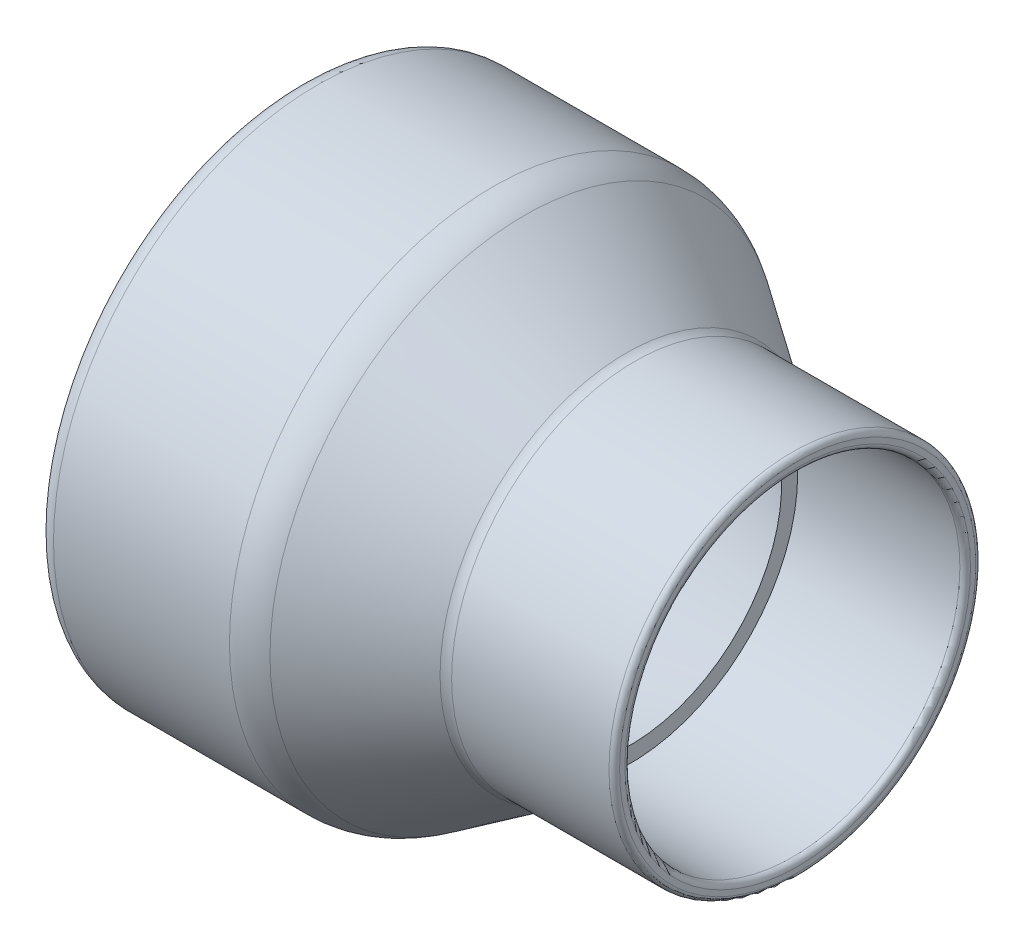
ISO-10303-21;
HEADER;
FILE_DESCRIPTION(('STEP AP214'),'2;1');
FILE_NAME('part.step','',(''),(''),'','','');
FILE_SCHEMA(('AUTOMOTIVE_DESIGN { 1 0 10303 214 1 1 1 1 }'));
ENDSEC;
DATA;
#1=APPLICATION_CONTEXT('core data for automotive mechanical design processes');
#2=APPLICATION_PROTOCOL_DEFINITION('international standard','automotive_design',2000,#1);
#3=PRODUCT_CONTEXT('',#1,'mechanical');
#4=PRODUCT('Part','Part','',(#3));
#5=PRODUCT_RELATED_PRODUCT_CATEGORY('part','',(#4));
#6=PRODUCT_DEFINITION_FORMATION('','',#4);
#7=PRODUCT_DEFINITION_CONTEXT('part definition',#1,'design');
#8=PRODUCT_DEFINITION('design','',#6,#7);
#9=PRODUCT_DEFINITION_SHAPE('','',#8);
#10=(LENGTH_UNIT() NAMED_UNIT(*) SI_UNIT(.MILLI.,.METRE.));
#11=(NAMED_UNIT(*) PLANE_ANGLE_UNIT() SI_UNIT($,.RADIAN.));
#12=(NAMED_UNIT(*) SI_UNIT($,.STERADIAN.) SOLID_ANGLE_UNIT());
#13=UNCERTAINTY_MEASURE_WITH_UNIT(LENGTH_MEASURE(1.E-05),#10,'distance_accuracy_value','');
#14=(GEOMETRIC_REPRESENTATION_CONTEXT(3) GLOBAL_UNCERTAINTY_ASSIGNED_CONTEXT((#13)) GLOBAL_UNIT_ASSIGNED_CONTEXT((#10,
#11,#12)) REPRESENTATION_CONTEXT('',''));
#15=CARTESIAN_POINT('',(0.,0.,0.));
#16=DIRECTION('',(0.,0.,1.));
#17=DIRECTION('',(1.,0.,0.));
#18=AXIS2_PLACEMENT_3D('',#15,#16,#17);
#19=CARTESIAN_POINT('',(9.76,18.1,0.));
#20=DIRECTION('',(-1.,0.,0.));
#21=DIRECTION('',(0.,0.,1.));
#22=AXIS2_PLACEMENT_3D('',#19,#20,#21);
#23=PLANE('',#22);
#24=CARTESIAN_POINT('',(9.76,0.,0.));
#25=DIRECTION('',(-1.,0.,0.));
#26=DIRECTION('',(0.,0.,1.));
#27=AXIS2_PLACEMENT_3D('',#24,#25,#26);
#28=CIRCLE('',#27,20.);
#29=CARTESIAN_POINT('',(9.76,0.,20.));
#30=VERTEX_POINT('',#29);
#31=EDGE_CURVE('E10',#30,#30,#28,.T.);
#32=ORIENTED_EDGE('',*,*,#31,.F.);
#33=EDGE_LOOP('',(#32));
#34=FACE_BOUND('',#33,.T.);
#35=CARTESIAN_POINT('',(9.76,0.,0.));
#36=DIRECTION('',(-1.,0.,0.));
#37=DIRECTION('',(0.,0.,1.));
#38=AXIS2_PLACEMENT_3D('',#35,#36,#37);
#39=CIRCLE('',#38,18.1);
#40=CARTESIAN_POINT('',(9.76,0.,18.1));
#41=VERTEX_POINT('',#40);
#42=EDGE_CURVE('E87',#41,#41,#39,.T.);
#43=ORIENTED_EDGE('',*,*,#42,.T.);
#44=EDGE_LOOP('',(#43));
#45=FACE_BOUND('',#44,.T.);
#46=ADVANCED_FACE('F32',(#34,#45),#23,.F.);
#47=CARTESIAN_POINT('',(-29.76,0.,0.));
#48=DIRECTION('',(-1.,0.,0.));
#49=DIRECTION('',(0.,0.,1.));
#50=AXIS2_PLACEMENT_3D('',#47,#48,#49);
#51=CYLINDRICAL_SURFACE('',#50,20.);
#52=CARTESIAN_POINT('',(29.1266666666667,0.,0.));
#53=DIRECTION('',(-1.,0.,0.));
#54=DIRECTION('',(0.,0.,1.));
#55=AXIS2_PLACEMENT_3D('',#52,#53,#54);
#56=CIRCLE('',#55,20.);
#57=CARTESIAN_POINT('',(29.1266666666667,0.,20.));
#58=VERTEX_POINT('',#57);
#59=EDGE_CURVE('E38',#58,#58,#56,.T.);
#60=ORIENTED_EDGE('',*,*,#59,.F.);
#61=EDGE_LOOP('',(#60));
#62=FACE_BOUND('',#61,.T.);
#63=ORIENTED_EDGE('',*,*,#31,.T.);
#64=EDGE_LOOP('',(#63));
#65=FACE_BOUND('',#64,.T.);
#66=ADVANCED_FACE('F178',(#62,#65),#51,.F.);
#67=CARTESIAN_POINT('',(29.1266666666667,0.,0.));
#68=DIRECTION('',(-1.,0.,0.));
#69=DIRECTION('',(0.,0.,1.));
#70=AXIS2_PLACEMENT_3D('',#67,#68,#69);
#71=TOROIDAL_SURFACE('',#70,20.6333333333333,0.633333333333333);
#72=CARTESIAN_POINT('',(29.76,0.,0.));
#73=DIRECTION('',(-1.,0.,0.));
#74=DIRECTION('',(0.,0.,1.));
#75=AXIS2_PLACEMENT_3D('',#72,#73,#74);
#76=CIRCLE('',#75,20.6333333333333);
#77=CARTESIAN_POINT('',(29.76,0.,20.6333333333333));
#78=VERTEX_POINT('',#77);
#79=EDGE_CURVE('E42',#78,#78,#76,.T.);
#80=ORIENTED_EDGE('',*,*,#79,.F.);
#81=EDGE_LOOP('',(#80));
#82=FACE_BOUND('',#81,.T.);
#83=ORIENTED_EDGE('',*,*,#59,.T.);
#84=EDGE_LOOP('',(#83));
#85=FACE_BOUND('',#84,.T.);
#86=ADVANCED_FACE('F173',(#82,#85),#71,.T.);
#87=CARTESIAN_POINT('',(29.76,20.6333333333333,0.));
#88=DIRECTION('',(-1.,0.,0.));
#89=DIRECTION('',(0.,0.,1.));
#90=AXIS2_PLACEMENT_3D('',#87,#88,#89);
#91=PLANE('',#90);
#92=CARTESIAN_POINT('',(29.76,0.,0.));
#93=DIRECTION('',(-1.,0.,0.));
#94=DIRECTION('',(0.,0.,1.));
#95=AXIS2_PLACEMENT_3D('',#92,#93,#94);
#96=CIRCLE('',#95,21.2666666666667);
#97=CARTESIAN_POINT('',(29.76,0.,21.2666666666667));
#98=VERTEX_POINT('',#97);
#99=EDGE_CURVE('E46',#98,#98,#96,.T.);
#100=ORIENTED_EDGE('',*,*,#99,.F.);
#101=EDGE_LOOP('',(#100));
#102=FACE_BOUND('',#101,.T.);
#103=ORIENTED_EDGE('',*,*,#79,.T.);
#104=EDGE_LOOP('',(#103));
#105=FACE_BOUND('',#104,.T.);
#106=ADVANCED_FACE('F167',(#102,#105),#91,.F.);
#107=CARTESIAN_POINT('',(29.1266666666667,0.,0.));
#108=DIRECTION('',(-1.,0.,0.));
#109=DIRECTION('',(0.,0.,1.));
#110=AXIS2_PLACEMENT_3D('',#107,#108,#109);
#111=TOROIDAL_SURFACE('',#110,21.2666666666667,0.633333333333333);
#112=CARTESIAN_POINT('',(29.1266666666667,0.,0.));
#113=DIRECTION('',(-1.,0.,0.));
#114=DIRECTION('',(0.,0.,1.));
#115=AXIS2_PLACEMENT_3D('',#112,#113,#114);
#116=CIRCLE('',#115,21.9);
#117=CARTESIAN_POINT('',(29.1266666666667,0.,21.9));
#118=VERTEX_POINT('',#117);
#119=EDGE_CURVE('E51',#118,#118,#116,.T.);
#120=ORIENTED_EDGE('',*,*,#119,.F.);
#121=EDGE_LOOP('',(#120));
#122=FACE_BOUND('',#121,.T.);
#123=ORIENTED_EDGE('',*,*,#99,.T.);
#124=EDGE_LOOP('',(#123));
#125=FACE_BOUND('',#124,.T.);
#126=ADVANCED_FACE('F161',(#122,#125),#111,.T.);
#127=CARTESIAN_POINT('',(-29.76,0.,0.));
#128=DIRECTION('',(-1.,0.,0.));
#129=DIRECTION('',(0.,0.,1.));
#130=AXIS2_PLACEMENT_3D('',#127,#128,#129);
#131=CYLINDRICAL_SURFACE('',#130,21.9);
#132=CARTESIAN_POINT('',(10.3379442187596,0.,0.));
#133=DIRECTION('',(-1.,0.,0.));
#134=DIRECTION('',(0.,0.,1.));
#135=AXIS2_PLACEMENT_3D('',#132,#133,#134);
#136=CIRCLE('',#135,21.9);
#137=CARTESIAN_POINT('',(10.3379442187596,0.,21.9));
#138=VERTEX_POINT('',#137);
#139=EDGE_CURVE('E54',#138,#138,#136,.T.);
#140=ORIENTED_EDGE('',*,*,#139,.F.);
#141=EDGE_LOOP('',(#140));
#142=FACE_BOUND('',#141,.T.);
#143=ORIENTED_EDGE('',*,*,#119,.T.);
#144=EDGE_LOOP('',(#143));
#145=FACE_BOUND('',#144,.T.);
#146=ADVANCED_FACE('F155',(#142,#145),#131,.T.);
#147=CARTESIAN_POINT('',(10.3379442187596,0.,0.));
#148=DIRECTION('',(-1.,0.,0.));
#149=DIRECTION('',(0.,0.,1.));
#150=AXIS2_PLACEMENT_3D('',#147,#148,#149);
#151=TOROIDAL_SURFACE('',#150,23.8,1.9);
#152=CARTESIAN_POINT('',(9.27994812155802,0.,0.));
#153=DIRECTION('',(-1.,0.,0.));
#154=DIRECTION('',(0.,0.,1.));
#155=AXIS2_PLACEMENT_3D('',#152,#153,#154);
#156=CIRCLE('',#155,22.221822488341);
#157=CARTESIAN_POINT('',(9.27994812155802,0.,22.221822488341));
#158=VERTEX_POINT('',#157);
#159=EDGE_CURVE('E57',#158,#158,#156,.T.);
#160=ORIENTED_EDGE('',*,*,#159,.F.);
#161=EDGE_LOOP('',(#160));
#162=FACE_BOUND('',#161,.T.);
#163=ORIENTED_EDGE('',*,*,#139,.T.);
#164=EDGE_LOOP('',(#163));
#165=FACE_BOUND('',#164,.T.);
#166=ADVANCED_FACE('F149',(#162,#165),#151,.F.);
#167=CARTESIAN_POINT('',(9.27994812155802,0.,0.));
#168=DIRECTION('',(-1.,0.,0.));
#169=DIRECTION('',(0.,0.,1.));
#170=AXIS2_PLACEMENT_3D('',#167,#168,#169);
#171=CONICAL_SURFACE('',#170,22.221822488341,0.590576600436917);
#172=CARTESIAN_POINT('',(-2.87560744406328,0.,0.));
#173=DIRECTION('',(-1.,0.,0.));
#174=DIRECTION('',(0.,0.,1.));
#175=AXIS2_PLACEMENT_3D('',#172,#173,#174);
#176=CIRCLE('',#175,30.3707982865229);
#177=CARTESIAN_POINT('',(-2.87560744406328,0.,30.3707982865229));
#178=VERTEX_POINT('',#177);
#179=EDGE_CURVE('E60',#178,#178,#176,.T.);
#180=ORIENTED_EDGE('',*,*,#179,.F.);
#181=EDGE_LOOP('',(#180));
#182=FACE_BOUND('',#181,.T.);
#183=ORIENTED_EDGE('',*,*,#159,.T.);
#184=EDGE_LOOP('',(#183));
#185=FACE_BOUND('',#184,.T.);
#186=ADVANCED_FACE('F143',(#182,#185),#171,.T.);
#187=CARTESIAN_POINT('',(-6.5878744517881,0.,0.));
#188=DIRECTION('',(-1.,0.,0.));
#189=DIRECTION('',(0.,0.,1.));
#190=AXIS2_PLACEMENT_3D('',#187,#188,#189);
#191=TOROIDAL_SURFACE('',#190,24.8333333333333,6.66666666666666);
#192=CARTESIAN_POINT('',(-6.5878744517881,0.,0.));
#193=DIRECTION('',(-1.,0.,0.));
#194=DIRECTION('',(0.,0.,1.));
#195=AXIS2_PLACEMENT_3D('',#192,#193,#194);
#196=CIRCLE('',#195,31.5);
#197=CARTESIAN_POINT('',(-6.5878744517881,0.,31.5));
#198=VERTEX_POINT('',#197);
#199=EDGE_CURVE('E63',#198,#198,#196,.T.);
#200=ORIENTED_EDGE('',*,*,#199,.F.);
#201=EDGE_LOOP('',(#200));
#202=FACE_BOUND('',#201,.T.);
#203=ORIENTED_EDGE('',*,*,#179,.T.);
#204=EDGE_LOOP('',(#203));
#205=FACE_BOUND('',#204,.T.);
#206=ADVANCED_FACE('F137',(#202,#205),#191,.T.);
#207=CARTESIAN_POINT('',(-29.76,0.,0.));
#208=DIRECTION('',(-1.,0.,0.));
#209=DIRECTION('',(0.,0.,1.));
#210=AXIS2_PLACEMENT_3D('',#207,#208,#209);
#211=CYLINDRICAL_SURFACE('',#210,31.5);
#212=CARTESIAN_POINT('',(-27.5933333333333,0.,0.));
#213=DIRECTION('',(-1.,0.,0.));
#214=DIRECTION('',(0.,0.,1.));
#215=AXIS2_PLACEMENT_3D('',#212,#213,#214);
#216=CIRCLE('',#215,31.5);
#217=CARTESIAN_POINT('',(-27.5933333333333,0.,31.5));
#218=VERTEX_POINT('',#217);
#219=EDGE_CURVE('E66',#218,#218,#216,.T.);
#220=ORIENTED_EDGE('',*,*,#219,.F.);
#221=EDGE_LOOP('',(#220));
#222=FACE_BOUND('',#221,.T.);
#223=ORIENTED_EDGE('',*,*,#199,.T.);
#224=EDGE_LOOP('',(#223));
#225=FACE_BOUND('',#224,.T.);
#226=ADVANCED_FACE('F131',(#222,#225),#211,.T.);
#227=CARTESIAN_POINT('',(-27.5933333333333,0.,0.));
#228=DIRECTION('',(-1.,0.,0.));
#229=DIRECTION('',(0.,0.,1.));
#230=AXIS2_PLACEMENT_3D('',#227,#228,#229);
#231=TOROIDAL_SURFACE('',#230,29.3333333333333,2.16666666666667);
#232=CARTESIAN_POINT('',(-29.76,0.,0.));
#233=DIRECTION('',(-1.,0.,0.));
#234=DIRECTION('',(0.,0.,1.));
#235=AXIS2_PLACEMENT_3D('',#232,#233,#234);
#236=CIRCLE('',#235,29.3333333333333);
#237=CARTESIAN_POINT('',(-29.76,0.,29.3333333333333));
#238=VERTEX_POINT('',#237);
#239=EDGE_CURVE('E69',#238,#238,#236,.T.);
#240=ORIENTED_EDGE('',*,*,#239,.F.);
#241=EDGE_LOOP('',(#240));
#242=FACE_BOUND('',#241,.T.);
#243=ORIENTED_EDGE('',*,*,#219,.T.);
#244=EDGE_LOOP('',(#243));
#245=FACE_BOUND('',#244,.T.);
#246=ADVANCED_FACE('F125',(#242,#245),#231,.T.);
#247=CARTESIAN_POINT('',(-29.76,29.3333333333333,0.));
#248=DIRECTION('',(1.,0.,0.));
#249=DIRECTION('',(0.,0.,-1.));
#250=AXIS2_PLACEMENT_3D('',#247,#248,#249);
#251=PLANE('',#250);
#252=CARTESIAN_POINT('',(-29.76,0.,0.));
#253=DIRECTION('',(-1.,0.,0.));
#254=DIRECTION('',(0.,0.,1.));
#255=AXIS2_PLACEMENT_3D('',#252,#253,#254);
#256=CIRCLE('',#255,27.1666666666667);
#257=CARTESIAN_POINT('',(-29.76,0.,27.1666666666667));
#258=VERTEX_POINT('',#257);
#259=EDGE_CURVE('E72',#258,#258,#256,.T.);
#260=ORIENTED_EDGE('',*,*,#259,.F.);
#261=EDGE_LOOP('',(#260));
#262=FACE_BOUND('',#261,.T.);
#263=ORIENTED_EDGE('',*,*,#239,.T.);
#264=EDGE_LOOP('',(#263));
#265=FACE_BOUND('',#264,.T.);
#266=ADVANCED_FACE('F119',(#262,#265),#251,.F.);
#267=CARTESIAN_POINT('',(-27.5933333333333,0.,0.));
#268=DIRECTION('',(-1.,0.,0.));
#269=DIRECTION('',(0.,0.,1.));
#270=AXIS2_PLACEMENT_3D('',#267,#268,#269);
#271=TOROIDAL_SURFACE('',#270,27.1666666666667,2.16666666666667);
#272=CARTESIAN_POINT('',(-27.5933333333333,0.,0.));
#273=DIRECTION('',(-1.,0.,0.));
#274=DIRECTION('',(0.,0.,1.));
#275=AXIS2_PLACEMENT_3D('',#272,#273,#274);
#276=CIRCLE('',#275,25.);
#277=CARTESIAN_POINT('',(-27.5933333333333,0.,25.));
#278=VERTEX_POINT('',#277);
#279=EDGE_CURVE('E75',#278,#278,#276,.T.);
#280=ORIENTED_EDGE('',*,*,#279,.F.);
#281=EDGE_LOOP('',(#280));
#282=FACE_BOUND('',#281,.T.);
#283=ORIENTED_EDGE('',*,*,#259,.T.);
#284=EDGE_LOOP('',(#283));
#285=FACE_BOUND('',#284,.T.);
#286=ADVANCED_FACE('F113',(#282,#285),#271,.T.);
#287=CARTESIAN_POINT('',(-29.76,0.,0.));
#288=DIRECTION('',(-1.,0.,0.));
#289=DIRECTION('',(0.,0.,1.));
#290=AXIS2_PLACEMENT_3D('',#287,#288,#289);
#291=CYLINDRICAL_SURFACE('',#290,25.);
#292=CARTESIAN_POINT('',(-5.19333333333333,0.,0.));
#293=DIRECTION('',(-1.,0.,0.));
#294=DIRECTION('',(0.,0.,1.));
#295=AXIS2_PLACEMENT_3D('',#292,#293,#294);
#296=CIRCLE('',#295,25.);
#297=CARTESIAN_POINT('',(-5.19333333333333,0.,25.));
#298=VERTEX_POINT('',#297);
#299=EDGE_CURVE('E78',#298,#298,#296,.T.);
#300=ORIENTED_EDGE('',*,*,#299,.F.);
#301=EDGE_LOOP('',(#300));
#302=FACE_BOUND('',#301,.T.);
#303=ORIENTED_EDGE('',*,*,#279,.T.);
#304=EDGE_LOOP('',(#303));
#305=FACE_BOUND('',#304,.T.);
#306=ADVANCED_FACE('F107',(#302,#305),#291,.F.);
#307=CARTESIAN_POINT('',(-5.19333333333333,0.,0.));
#308=DIRECTION('',(-1.,0.,0.));
#309=DIRECTION('',(0.,0.,1.));
#310=AXIS2_PLACEMENT_3D('',#307,#308,#309);
#311=TOROIDAL_SURFACE('',#310,24.3666666666667,0.633333333333335);
#312=CARTESIAN_POINT('',(-4.56,0.,0.));
#313=DIRECTION('',(-1.,0.,0.));
#314=DIRECTION('',(0.,0.,1.));
#315=AXIS2_PLACEMENT_3D('',#312,#313,#314);
#316=CIRCLE('',#315,24.3666666666667);
#317=CARTESIAN_POINT('',(-4.56,0.,24.3666666666667));
#318=VERTEX_POINT('',#317);
#319=EDGE_CURVE('E81',#318,#318,#316,.T.);
#320=ORIENTED_EDGE('',*,*,#319,.F.);
#321=EDGE_LOOP('',(#320));
#322=FACE_BOUND('',#321,.T.);
#323=ORIENTED_EDGE('',*,*,#299,.T.);
#324=EDGE_LOOP('',(#323));
#325=FACE_BOUND('',#324,.T.);
#326=ADVANCED_FACE('F101',(#322,#325),#311,.F.);
#327=CARTESIAN_POINT('',(-4.56,23.1,0.));
#328=DIRECTION('',(1.,0.,0.));
#329=DIRECTION('',(0.,0.,-1.));
#330=AXIS2_PLACEMENT_3D('',#327,#328,#329);
#331=PLANE('',#330);
#332=CARTESIAN_POINT('',(-4.56,0.,0.));
#333=DIRECTION('',(-1.,0.,0.));
#334=DIRECTION('',(0.,0.,1.));
#335=AXIS2_PLACEMENT_3D('',#332,#333,#334);
#336=CIRCLE('',#335,23.1);
#337=CARTESIAN_POINT('',(-4.56,0.,23.1));
#338=VERTEX_POINT('',#337);
#339=EDGE_CURVE('E84',#338,#338,#336,.T.);
#340=ORIENTED_EDGE('',*,*,#339,.F.);
#341=EDGE_LOOP('',(#340));
#342=FACE_BOUND('',#341,.T.);
#343=ORIENTED_EDGE('',*,*,#319,.T.);
#344=EDGE_LOOP('',(#343));
#345=FACE_BOUND('',#344,.T.);
#346=ADVANCED_FACE('F95',(#342,#345),#331,.F.);
#347=CARTESIAN_POINT('',(-4.56,0.,0.));
#348=DIRECTION('',(-1.,0.,0.));
#349=DIRECTION('',(0.,0.,1.));
#350=AXIS2_PLACEMENT_3D('',#347,#348,#349);
#351=CONICAL_SURFACE('',#350,23.1,0.335928086482585);
#352=ORIENTED_EDGE('',*,*,#42,.F.);
#353=EDGE_LOOP('',(#352));
#354=FACE_BOUND('',#353,.T.);
#355=ORIENTED_EDGE('',*,*,#339,.T.);
#356=EDGE_LOOP('',(#355));
#357=FACE_BOUND('',#356,.T.);
#358=ADVANCED_FACE('F92',(#354,#357),#351,.F.);
#359=CLOSED_SHELL('',(#46,#66,#86,#106,#126,#146,#166,#186,#206,#226,#246,#266,#286,#306,#326,
#346,#358));
#360=MANIFOLD_SOLID_BREP('B2',#359);
#361=ADVANCED_BREP_SHAPE_REPRESENTATION('',(#18,#360),#14);
#362=SHAPE_DEFINITION_REPRESENTATION(#9,#361);
ENDSEC;
END-ISO-10303-21;
